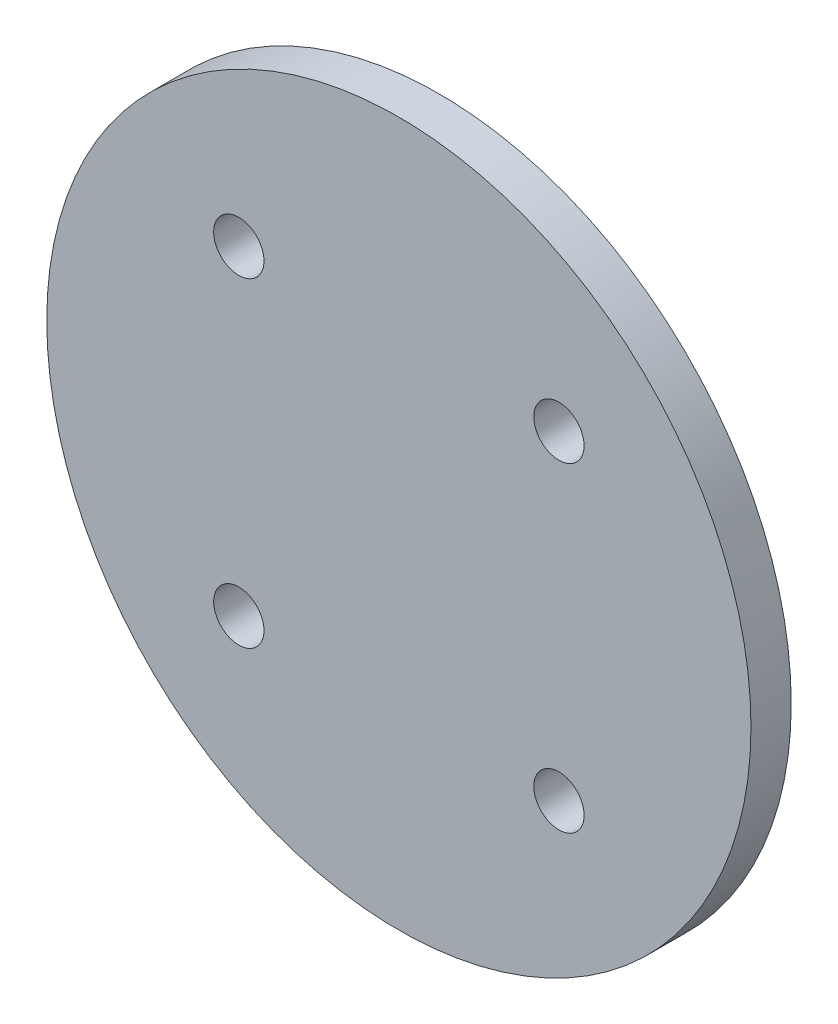
ISO-10303-21;
HEADER;
FILE_DESCRIPTION(('STEP AP214'),'2;1');
FILE_NAME('part.step','',(''),(''),'','','');
FILE_SCHEMA(('AUTOMOTIVE_DESIGN { 1 0 10303 214 1 1 1 1 }'));
ENDSEC;
DATA;
#1=APPLICATION_CONTEXT('core data for automotive mechanical design processes');
#2=APPLICATION_PROTOCOL_DEFINITION('international standard','automotive_design',2000,#1);
#3=PRODUCT_CONTEXT('',#1,'mechanical');
#4=PRODUCT('Part','Part','',(#3));
#5=PRODUCT_RELATED_PRODUCT_CATEGORY('part','',(#4));
#6=PRODUCT_DEFINITION_FORMATION('','',#4);
#7=PRODUCT_DEFINITION_CONTEXT('part definition',#1,'design');
#8=PRODUCT_DEFINITION('design','',#6,#7);
#9=PRODUCT_DEFINITION_SHAPE('','',#8);
#10=(LENGTH_UNIT() NAMED_UNIT(*) SI_UNIT(.MILLI.,.METRE.));
#11=(NAMED_UNIT(*) PLANE_ANGLE_UNIT() SI_UNIT($,.RADIAN.));
#12=(NAMED_UNIT(*) SI_UNIT($,.STERADIAN.) SOLID_ANGLE_UNIT());
#13=UNCERTAINTY_MEASURE_WITH_UNIT(LENGTH_MEASURE(1.E-05),#10,'distance_accuracy_value','');
#14=(GEOMETRIC_REPRESENTATION_CONTEXT(3) GLOBAL_UNCERTAINTY_ASSIGNED_CONTEXT((#13)) GLOBAL_UNIT_ASSIGNED_CONTEXT((#10,
#11,#12)) REPRESENTATION_CONTEXT('',''));
#15=CARTESIAN_POINT('',(0.,0.,0.));
#16=DIRECTION('',(0.,0.,1.));
#17=DIRECTION('',(1.,0.,0.));
#18=AXIS2_PLACEMENT_3D('',#15,#16,#17);
#19=CARTESIAN_POINT('',(0.,0.,4.));
#20=DIRECTION('',(0.,0.,1.));
#21=DIRECTION('',(1.,0.,0.));
#22=AXIS2_PLACEMENT_3D('',#19,#20,#21);
#23=PLANE('',#22);
#24=CARTESIAN_POINT('',(15.9099025766973,-15.9099025766974,4.));
#25=DIRECTION('',(0.,0.,1.));
#26=DIRECTION('',(1.,0.,0.));
#27=AXIS2_PLACEMENT_3D('',#24,#25,#26);
#28=CIRCLE('',#27,2.5);
#29=CARTESIAN_POINT('',(18.4099025766973,-15.9099025766974,4.));
#30=VERTEX_POINT('',#29);
#31=EDGE_CURVE('E81',#30,#30,#28,.T.);
#32=ORIENTED_EDGE('',*,*,#31,.F.);
#33=EDGE_LOOP('',(#32));
#34=FACE_BOUND('',#33,.T.);
#35=CARTESIAN_POINT('',(-15.9099025766972,15.9099025766975,4.));
#36=DIRECTION('',(0.,0.,1.));
#37=DIRECTION('',(1.,0.,0.));
#38=AXIS2_PLACEMENT_3D('',#35,#36,#37);
#39=CIRCLE('',#38,2.5);
#40=CARTESIAN_POINT('',(-13.4099025766972,15.9099025766975,4.));
#41=VERTEX_POINT('',#40);
#42=EDGE_CURVE('E70',#41,#41,#39,.T.);
#43=ORIENTED_EDGE('',*,*,#42,.F.);
#44=EDGE_LOOP('',(#43));
#45=FACE_BOUND('',#44,.T.);
#46=CARTESIAN_POINT('',(0.,0.,4.));
#47=DIRECTION('',(0.,0.,1.));
#48=DIRECTION('',(1.,0.,0.));
#49=AXIS2_PLACEMENT_3D('',#46,#47,#48);
#50=CIRCLE('',#49,35.);
#51=CARTESIAN_POINT('',(35.,0.,4.));
#52=VERTEX_POINT('',#51);
#53=EDGE_CURVE('E11',#52,#52,#50,.T.);
#54=ORIENTED_EDGE('',*,*,#53,.T.);
#55=EDGE_LOOP('',(#54));
#56=FACE_BOUND('',#55,.T.);
#57=CARTESIAN_POINT('',(15.9099025766973,15.9099025766974,4.));
#58=DIRECTION('',(0.,0.,1.));
#59=DIRECTION('',(1.,0.,0.));
#60=AXIS2_PLACEMENT_3D('',#57,#58,#59);
#61=CIRCLE('',#60,2.5);
#62=CARTESIAN_POINT('',(18.4099025766973,15.9099025766974,4.));
#63=VERTEX_POINT('',#62);
#64=EDGE_CURVE('E75',#63,#63,#61,.T.);
#65=ORIENTED_EDGE('',*,*,#64,.F.);
#66=EDGE_LOOP('',(#65));
#67=FACE_BOUND('',#66,.T.);
#68=CARTESIAN_POINT('',(-15.9099025766974,-15.9099025766972,4.));
#69=DIRECTION('',(0.,0.,1.));
#70=DIRECTION('',(1.,0.,0.));
#71=AXIS2_PLACEMENT_3D('',#68,#69,#70);
#72=CIRCLE('',#71,2.5);
#73=CARTESIAN_POINT('',(-13.4099025766974,-15.9099025766972,4.));
#74=VERTEX_POINT('',#73);
#75=EDGE_CURVE('E87',#74,#74,#72,.T.);
#76=ORIENTED_EDGE('',*,*,#75,.F.);
#77=EDGE_LOOP('',(#76));
#78=FACE_BOUND('',#77,.T.);
#79=ADVANCED_FACE('F59',(#34,#45,#56,#67,#78),#23,.T.);
#80=CARTESIAN_POINT('',(0.,0.,0.));
#81=DIRECTION('',(0.,0.,1.));
#82=DIRECTION('',(1.,0.,0.));
#83=AXIS2_PLACEMENT_3D('',#80,#81,#82);
#84=PLANE('',#83);
#85=CARTESIAN_POINT('',(0.,0.,0.));
#86=DIRECTION('',(0.,0.,1.));
#87=DIRECTION('',(1.,0.,0.));
#88=AXIS2_PLACEMENT_3D('',#85,#86,#87);
#89=CIRCLE('',#88,35.);
#90=CARTESIAN_POINT('',(35.,0.,0.));
#91=VERTEX_POINT('',#90);
#92=EDGE_CURVE('E63',#91,#91,#89,.T.);
#93=ORIENTED_EDGE('',*,*,#92,.F.);
#94=EDGE_LOOP('',(#93));
#95=FACE_BOUND('',#94,.T.);
#96=CARTESIAN_POINT('',(-15.9099025766972,15.9099025766975,0.));
#97=DIRECTION('',(0.,0.,1.));
#98=DIRECTION('',(1.,0.,0.));
#99=AXIS2_PLACEMENT_3D('',#96,#97,#98);
#100=CIRCLE('',#99,2.5);
#101=CARTESIAN_POINT('',(-13.4099025766972,15.9099025766975,0.));
#102=VERTEX_POINT('',#101);
#103=EDGE_CURVE('E72',#102,#102,#100,.T.);
#104=ORIENTED_EDGE('',*,*,#103,.T.);
#105=EDGE_LOOP('',(#104));
#106=FACE_BOUND('',#105,.T.);
#107=CARTESIAN_POINT('',(15.9099025766973,15.9099025766974,0.));
#108=DIRECTION('',(0.,0.,1.));
#109=DIRECTION('',(1.,0.,0.));
#110=AXIS2_PLACEMENT_3D('',#107,#108,#109);
#111=CIRCLE('',#110,2.5);
#112=CARTESIAN_POINT('',(18.4099025766973,15.9099025766974,0.));
#113=VERTEX_POINT('',#112);
#114=EDGE_CURVE('E78',#113,#113,#111,.T.);
#115=ORIENTED_EDGE('',*,*,#114,.T.);
#116=EDGE_LOOP('',(#115));
#117=FACE_BOUND('',#116,.T.);
#118=CARTESIAN_POINT('',(15.9099025766973,-15.9099025766974,0.));
#119=DIRECTION('',(0.,0.,1.));
#120=DIRECTION('',(1.,0.,0.));
#121=AXIS2_PLACEMENT_3D('',#118,#119,#120);
#122=CIRCLE('',#121,2.5);
#123=CARTESIAN_POINT('',(18.4099025766973,-15.9099025766974,0.));
#124=VERTEX_POINT('',#123);
#125=EDGE_CURVE('E84',#124,#124,#122,.T.);
#126=ORIENTED_EDGE('',*,*,#125,.T.);
#127=EDGE_LOOP('',(#126));
#128=FACE_BOUND('',#127,.T.);
#129=CARTESIAN_POINT('',(-15.9099025766974,-15.9099025766972,0.));
#130=DIRECTION('',(0.,0.,1.));
#131=DIRECTION('',(1.,0.,0.));
#132=AXIS2_PLACEMENT_3D('',#129,#130,#131);
#133=CIRCLE('',#132,2.5);
#134=CARTESIAN_POINT('',(-13.4099025766974,-15.9099025766972,0.));
#135=VERTEX_POINT('',#134);
#136=EDGE_CURVE('E90',#135,#135,#133,.T.);
#137=ORIENTED_EDGE('',*,*,#136,.T.);
#138=EDGE_LOOP('',(#137));
#139=FACE_BOUND('',#138,.T.);
#140=ADVANCED_FACE('F100',(#95,#106,#117,#128,#139),#84,.F.);
#141=CARTESIAN_POINT('',(0.,0.,4.));
#142=DIRECTION('',(0.,0.,-1.));
#143=DIRECTION('',(-1.,0.,0.));
#144=AXIS2_PLACEMENT_3D('',#141,#142,#143);
#145=CYLINDRICAL_SURFACE('',#144,35.);
#146=ORIENTED_EDGE('',*,*,#53,.F.);
#147=EDGE_LOOP('',(#146));
#148=FACE_BOUND('',#147,.T.);
#149=ORIENTED_EDGE('',*,*,#92,.T.);
#150=EDGE_LOOP('',(#149));
#151=FACE_BOUND('',#150,.T.);
#152=ADVANCED_FACE('F61',(#148,#151),#145,.T.);
#153=CARTESIAN_POINT('',(-15.9099025766972,15.9099025766975,4.));
#154=DIRECTION('',(0.,0.,-1.));
#155=DIRECTION('',(-1.,0.,0.));
#156=AXIS2_PLACEMENT_3D('',#153,#154,#155);
#157=CYLINDRICAL_SURFACE('',#156,2.5);
#158=ORIENTED_EDGE('',*,*,#42,.T.);
#159=EDGE_LOOP('',(#158));
#160=FACE_BOUND('',#159,.T.);
#161=ORIENTED_EDGE('',*,*,#103,.F.);
#162=EDGE_LOOP('',(#161));
#163=FACE_BOUND('',#162,.T.);
#164=ADVANCED_FACE('F110',(#160,#163),#157,.F.);
#165=CARTESIAN_POINT('',(15.9099025766973,15.9099025766974,4.));
#166=DIRECTION('',(0.,0.,-1.));
#167=DIRECTION('',(-1.,0.,0.));
#168=AXIS2_PLACEMENT_3D('',#165,#166,#167);
#169=CYLINDRICAL_SURFACE('',#168,2.5);
#170=ORIENTED_EDGE('',*,*,#64,.T.);
#171=EDGE_LOOP('',(#170));
#172=FACE_BOUND('',#171,.T.);
#173=ORIENTED_EDGE('',*,*,#114,.F.);
#174=EDGE_LOOP('',(#173));
#175=FACE_BOUND('',#174,.T.);
#176=ADVANCED_FACE('F113',(#172,#175),#169,.F.);
#177=CARTESIAN_POINT('',(15.9099025766973,-15.9099025766974,4.));
#178=DIRECTION('',(0.,0.,-1.));
#179=DIRECTION('',(-1.,0.,0.));
#180=AXIS2_PLACEMENT_3D('',#177,#178,#179);
#181=CYLINDRICAL_SURFACE('',#180,2.5);
#182=ORIENTED_EDGE('',*,*,#31,.T.);
#183=EDGE_LOOP('',(#182));
#184=FACE_BOUND('',#183,.T.);
#185=ORIENTED_EDGE('',*,*,#125,.F.);
#186=EDGE_LOOP('',(#185));
#187=FACE_BOUND('',#186,.T.);
#188=ADVANCED_FACE('F117',(#184,#187),#181,.F.);
#189=CARTESIAN_POINT('',(-15.9099025766974,-15.9099025766972,4.));
#190=DIRECTION('',(0.,0.,-1.));
#191=DIRECTION('',(-1.,0.,0.));
#192=AXIS2_PLACEMENT_3D('',#189,#190,#191);
#193=CYLINDRICAL_SURFACE('',#192,2.5);
#194=ORIENTED_EDGE('',*,*,#75,.T.);
#195=EDGE_LOOP('',(#194));
#196=FACE_BOUND('',#195,.T.);
#197=ORIENTED_EDGE('',*,*,#136,.F.);
#198=EDGE_LOOP('',(#197));
#199=FACE_BOUND('',#198,.T.);
#200=ADVANCED_FACE('F96',(#196,#199),#193,.F.);
#201=CLOSED_SHELL('',(#79,#140,#152,#164,#176,#188,#200));
#202=MANIFOLD_SOLID_BREP('B2',#201);
#203=ADVANCED_BREP_SHAPE_REPRESENTATION('',(#18,#202),#14);
#204=SHAPE_DEFINITION_REPRESENTATION(#9,#203);
ENDSEC;
END-ISO-10303-21;
